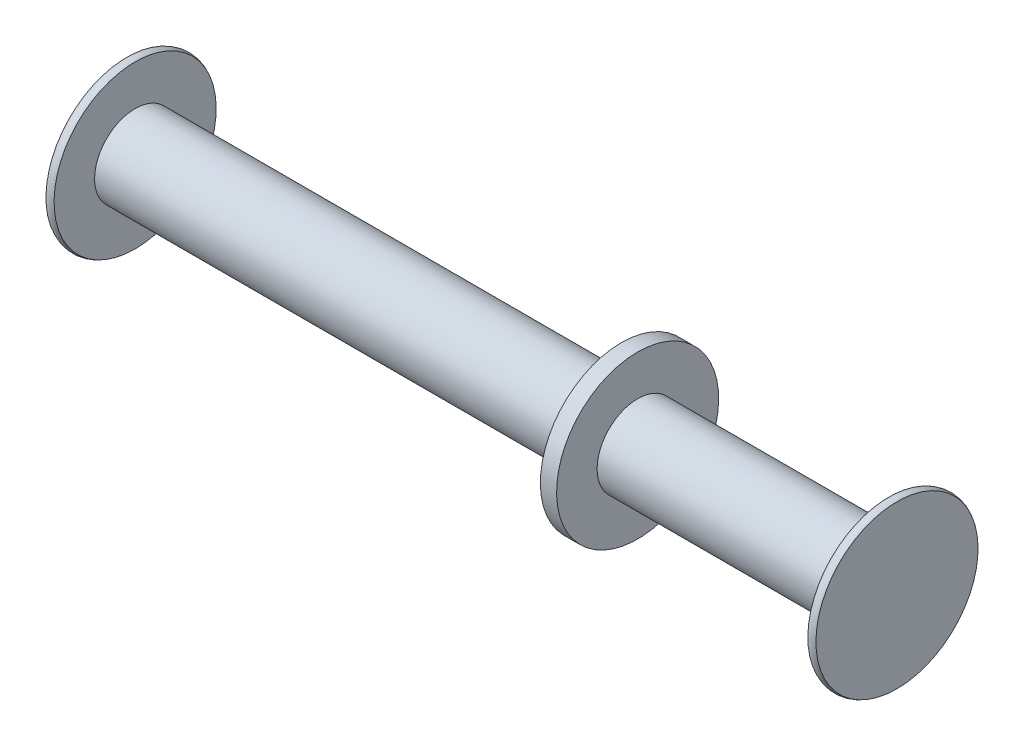
ISO-10303-21;
HEADER;
FILE_DESCRIPTION(('STEP AP214'),'2;1');
FILE_NAME('part.step','',(''),(''),'','','');
FILE_SCHEMA(('AUTOMOTIVE_DESIGN { 1 0 10303 214 1 1 1 1 }'));
ENDSEC;
DATA;
#1=APPLICATION_CONTEXT('core data for automotive mechanical design processes');
#2=APPLICATION_PROTOCOL_DEFINITION('international standard','automotive_design',2000,#1);
#3=PRODUCT_CONTEXT('',#1,'mechanical');
#4=PRODUCT('Part','Part','',(#3));
#5=PRODUCT_RELATED_PRODUCT_CATEGORY('part','',(#4));
#6=PRODUCT_DEFINITION_FORMATION('','',#4);
#7=PRODUCT_DEFINITION_CONTEXT('part definition',#1,'design');
#8=PRODUCT_DEFINITION('design','',#6,#7);
#9=PRODUCT_DEFINITION_SHAPE('','',#8);
#10=(LENGTH_UNIT() NAMED_UNIT(*) SI_UNIT(.MILLI.,.METRE.));
#11=(NAMED_UNIT(*) PLANE_ANGLE_UNIT() SI_UNIT($,.RADIAN.));
#12=(NAMED_UNIT(*) SI_UNIT($,.STERADIAN.) SOLID_ANGLE_UNIT());
#13=UNCERTAINTY_MEASURE_WITH_UNIT(LENGTH_MEASURE(1.E-05),#10,'distance_accuracy_value','');
#14=(GEOMETRIC_REPRESENTATION_CONTEXT(3) GLOBAL_UNCERTAINTY_ASSIGNED_CONTEXT((#13)) GLOBAL_UNIT_ASSIGNED_CONTEXT((#10,
#11,#12)) REPRESENTATION_CONTEXT('',''));
#15=CARTESIAN_POINT('',(0.,0.,0.));
#16=DIRECTION('',(0.,0.,1.));
#17=DIRECTION('',(1.,0.,0.));
#18=AXIS2_PLACEMENT_3D('',#15,#16,#17);
#19=CARTESIAN_POINT('',(-47.5,0.,0.));
#20=DIRECTION('',(-1.,0.,0.));
#21=DIRECTION('',(0.,-1.,0.));
#22=AXIS2_PLACEMENT_3D('',#19,#20,#21);
#23=CYLINDRICAL_SURFACE('',#22,5.);
#24=CARTESIAN_POINT('',(15.5,0.,0.));
#25=DIRECTION('',(1.,0.,0.));
#26=DIRECTION('',(0.,1.,0.));
#27=AXIS2_PLACEMENT_3D('',#24,#25,#26);
#28=CIRCLE('',#27,5.);
#29=CARTESIAN_POINT('',(15.5,5.00000000000001,0.));
#30=VERTEX_POINT('',#29);
#31=EDGE_CURVE('E10',#30,#30,#28,.F.);
#32=ORIENTED_EDGE('',*,*,#31,.F.);
#33=EDGE_LOOP('',(#32));
#34=FACE_BOUND('',#33,.T.);
#35=CARTESIAN_POINT('',(46.5,0.,0.));
#36=DIRECTION('',(-1.,0.,0.));
#37=DIRECTION('',(0.,-1.,0.));
#38=AXIS2_PLACEMENT_3D('',#35,#36,#37);
#39=CIRCLE('',#38,5.);
#40=CARTESIAN_POINT('',(46.5,-4.99999999999999,0.));
#41=VERTEX_POINT('',#40);
#42=EDGE_CURVE('E85',#41,#41,#39,.T.);
#43=ORIENTED_EDGE('',*,*,#42,.T.);
#44=EDGE_LOOP('',(#43));
#45=FACE_BOUND('',#44,.T.);
#46=ADVANCED_FACE('F39',(#34,#45),#23,.T.);
#47=CARTESIAN_POINT('',(46.5,-4.99999999999999,0.));
#48=DIRECTION('',(-1.,0.,0.));
#49=DIRECTION('',(0.,-1.,0.));
#50=AXIS2_PLACEMENT_3D('',#47,#48,#49);
#51=PLANE('',#50);
#52=CARTESIAN_POINT('',(46.5,0.,0.));
#53=DIRECTION('',(-1.,0.,0.));
#54=DIRECTION('',(0.,-1.,0.));
#55=AXIS2_PLACEMENT_3D('',#52,#53,#54);
#56=CIRCLE('',#55,10.);
#57=CARTESIAN_POINT('',(46.5,-9.99999999999999,0.));
#58=VERTEX_POINT('',#57);
#59=EDGE_CURVE('E71',#58,#58,#56,.T.);
#60=ORIENTED_EDGE('',*,*,#59,.T.);
#61=EDGE_LOOP('',(#60));
#62=FACE_BOUND('',#61,.T.);
#63=ORIENTED_EDGE('',*,*,#42,.F.);
#64=EDGE_LOOP('',(#63));
#65=FACE_BOUND('',#64,.T.);
#66=ADVANCED_FACE('F106',(#62,#65),#51,.T.);
#67=CARTESIAN_POINT('',(47.,0.,0.));
#68=DIRECTION('',(-1.,0.,0.));
#69=DIRECTION('',(0.,-1.,0.));
#70=AXIS2_PLACEMENT_3D('',#67,#68,#69);
#71=TOROIDAL_SURFACE('',#70,9.13397459621556,0.999999999999998);
#72=CARTESIAN_POINT('',(47.5,0.,0.));
#73=DIRECTION('',(-1.,0.,0.));
#74=DIRECTION('',(0.,-1.,0.));
#75=AXIS2_PLACEMENT_3D('',#72,#73,#74);
#76=CIRCLE('',#75,10.);
#77=CARTESIAN_POINT('',(47.5,-9.99999999999999,0.));
#78=VERTEX_POINT('',#77);
#79=EDGE_CURVE('E64',#78,#78,#76,.T.);
#80=ORIENTED_EDGE('',*,*,#79,.T.);
#81=EDGE_LOOP('',(#80));
#82=FACE_BOUND('',#81,.T.);
#83=ORIENTED_EDGE('',*,*,#59,.F.);
#84=EDGE_LOOP('',(#83));
#85=FACE_BOUND('',#84,.T.);
#86=ADVANCED_FACE('F113',(#82,#85),#71,.T.);
#87=CARTESIAN_POINT('',(47.5,0.,0.));
#88=DIRECTION('',(1.,0.,0.));
#89=DIRECTION('',(0.,1.,0.));
#90=AXIS2_PLACEMENT_3D('',#87,#88,#89);
#91=PLANE('',#90);
#92=ORIENTED_EDGE('',*,*,#79,.F.);
#93=EDGE_LOOP('',(#92));
#94=FACE_BOUND('',#93,.T.);
#95=ADVANCED_FACE('F121',(#94),#91,.T.);
#96=CARTESIAN_POINT('',(15.5,0.,0.));
#97=DIRECTION('',(-1.,0.,0.));
#98=DIRECTION('',(0.,-1.,0.));
#99=AXIS2_PLACEMENT_3D('',#96,#97,#98);
#100=CYLINDRICAL_SURFACE('',#99,10.);
#101=CARTESIAN_POINT('',(15.5,0.,0.));
#102=DIRECTION('',(1.,0.,0.));
#103=DIRECTION('',(0.,1.,0.));
#104=AXIS2_PLACEMENT_3D('',#101,#102,#103);
#105=CIRCLE('',#104,10.);
#106=CARTESIAN_POINT('',(15.5,10.,0.));
#107=VERTEX_POINT('',#106);
#108=EDGE_CURVE('E65',#107,#107,#105,.T.);
#109=ORIENTED_EDGE('',*,*,#108,.F.);
#110=EDGE_LOOP('',(#109));
#111=FACE_BOUND('',#110,.T.);
#112=CARTESIAN_POINT('',(13.5,0.,0.));
#113=DIRECTION('',(1.,0.,0.));
#114=DIRECTION('',(0.,1.,0.));
#115=AXIS2_PLACEMENT_3D('',#112,#113,#114);
#116=CIRCLE('',#115,10.);
#117=CARTESIAN_POINT('',(13.5,10.,0.));
#118=VERTEX_POINT('',#117);
#119=EDGE_CURVE('E74',#118,#118,#116,.T.);
#120=ORIENTED_EDGE('',*,*,#119,.T.);
#121=EDGE_LOOP('',(#120));
#122=FACE_BOUND('',#121,.T.);
#123=ADVANCED_FACE('F127',(#111,#122),#100,.T.);
#124=CARTESIAN_POINT('',(15.5,0.,0.));
#125=DIRECTION('',(1.,0.,0.));
#126=DIRECTION('',(0.,1.,0.));
#127=AXIS2_PLACEMENT_3D('',#124,#125,#126);
#128=PLANE('',#127);
#129=ORIENTED_EDGE('',*,*,#31,.T.);
#130=EDGE_LOOP('',(#129));
#131=FACE_BOUND('',#130,.T.);
#132=ORIENTED_EDGE('',*,*,#108,.T.);
#133=EDGE_LOOP('',(#132));
#134=FACE_BOUND('',#133,.T.);
#135=ADVANCED_FACE('F131',(#131,#134),#128,.T.);
#136=CARTESIAN_POINT('',(13.5,0.,0.));
#137=DIRECTION('',(1.,0.,0.));
#138=DIRECTION('',(0.,1.,0.));
#139=AXIS2_PLACEMENT_3D('',#136,#137,#138);
#140=PLANE('',#139);
#141=CARTESIAN_POINT('',(13.5,0.,0.));
#142=DIRECTION('',(1.,0.,0.));
#143=DIRECTION('',(0.,1.,0.));
#144=AXIS2_PLACEMENT_3D('',#141,#142,#143);
#145=CIRCLE('',#144,5.);
#146=CARTESIAN_POINT('',(13.5,5.00000000000001,0.));
#147=VERTEX_POINT('',#146);
#148=EDGE_CURVE('E61',#147,#147,#145,.F.);
#149=ORIENTED_EDGE('',*,*,#148,.F.);
#150=EDGE_LOOP('',(#149));
#151=FACE_BOUND('',#150,.T.);
#152=ORIENTED_EDGE('',*,*,#119,.F.);
#153=EDGE_LOOP('',(#152));
#154=FACE_BOUND('',#153,.T.);
#155=ADVANCED_FACE('F133',(#151,#154),#140,.F.);
#156=CARTESIAN_POINT('',(-47.5,0.,0.));
#157=DIRECTION('',(-1.,0.,0.));
#158=DIRECTION('',(0.,-1.,0.));
#159=AXIS2_PLACEMENT_3D('',#156,#157,#158);
#160=PLANE('',#159);
#161=CARTESIAN_POINT('',(-47.5,0.,0.));
#162=DIRECTION('',(-1.,0.,0.));
#163=DIRECTION('',(0.,-1.,0.));
#164=AXIS2_PLACEMENT_3D('',#161,#162,#163);
#165=CIRCLE('',#164,10.);
#166=CARTESIAN_POINT('',(-47.5,-10.,0.));
#167=VERTEX_POINT('',#166);
#168=EDGE_CURVE('E47',#167,#167,#165,.T.);
#169=ORIENTED_EDGE('',*,*,#168,.T.);
#170=EDGE_LOOP('',(#169));
#171=FACE_BOUND('',#170,.T.);
#172=ADVANCED_FACE('F41',(#171),#160,.T.);
#173=CARTESIAN_POINT('',(-47.,0.,0.));
#174=DIRECTION('',(-1.,0.,0.));
#175=DIRECTION('',(0.,-1.,0.));
#176=AXIS2_PLACEMENT_3D('',#173,#174,#175);
#177=TOROIDAL_SURFACE('',#176,9.13397459621556,0.999999999999998);
#178=CARTESIAN_POINT('',(-46.5,0.,0.));
#179=DIRECTION('',(-1.,0.,0.));
#180=DIRECTION('',(0.,-1.,0.));
#181=AXIS2_PLACEMENT_3D('',#178,#179,#180);
#182=CIRCLE('',#181,10.);
#183=CARTESIAN_POINT('',(-46.5,-10.,0.));
#184=VERTEX_POINT('',#183);
#185=EDGE_CURVE('E52',#184,#184,#182,.T.);
#186=ORIENTED_EDGE('',*,*,#185,.T.);
#187=EDGE_LOOP('',(#186));
#188=FACE_BOUND('',#187,.T.);
#189=ORIENTED_EDGE('',*,*,#168,.F.);
#190=EDGE_LOOP('',(#189));
#191=FACE_BOUND('',#190,.T.);
#192=ADVANCED_FACE('F102',(#188,#191),#177,.T.);
#193=CARTESIAN_POINT('',(-46.5,-5.,0.));
#194=DIRECTION('',(1.,0.,0.));
#195=DIRECTION('',(0.,1.,0.));
#196=AXIS2_PLACEMENT_3D('',#193,#194,#195);
#197=PLANE('',#196);
#198=CARTESIAN_POINT('',(-46.5,0.,0.));
#199=DIRECTION('',(-1.,0.,0.));
#200=DIRECTION('',(0.,-1.,0.));
#201=AXIS2_PLACEMENT_3D('',#198,#199,#200);
#202=CIRCLE('',#201,5.);
#203=CARTESIAN_POINT('',(-46.5,-5.,0.));
#204=VERTEX_POINT('',#203);
#205=EDGE_CURVE('E58',#204,#204,#202,.T.);
#206=ORIENTED_EDGE('',*,*,#205,.T.);
#207=EDGE_LOOP('',(#206));
#208=FACE_BOUND('',#207,.T.);
#209=ORIENTED_EDGE('',*,*,#185,.F.);
#210=EDGE_LOOP('',(#209));
#211=FACE_BOUND('',#210,.T.);
#212=ADVANCED_FACE('F92',(#208,#211),#197,.T.);
#213=ORIENTED_EDGE('',*,*,#205,.F.);
#214=EDGE_LOOP('',(#213));
#215=FACE_BOUND('',#214,.T.);
#216=ORIENTED_EDGE('',*,*,#148,.T.);
#217=EDGE_LOOP('',(#216));
#218=FACE_BOUND('',#217,.T.);
#219=ADVANCED_FACE('F95',(#215,#218),#23,.T.);
#220=CLOSED_SHELL('',(#46,#66,#86,#95,#123,#135,#155,#172,#192,#212,#219));
#221=MANIFOLD_SOLID_BREP('B2',#220);
#222=ADVANCED_BREP_SHAPE_REPRESENTATION('',(#18,#221),#14);
#223=SHAPE_DEFINITION_REPRESENTATION(#9,#222);
ENDSEC;
END-ISO-10303-21;
